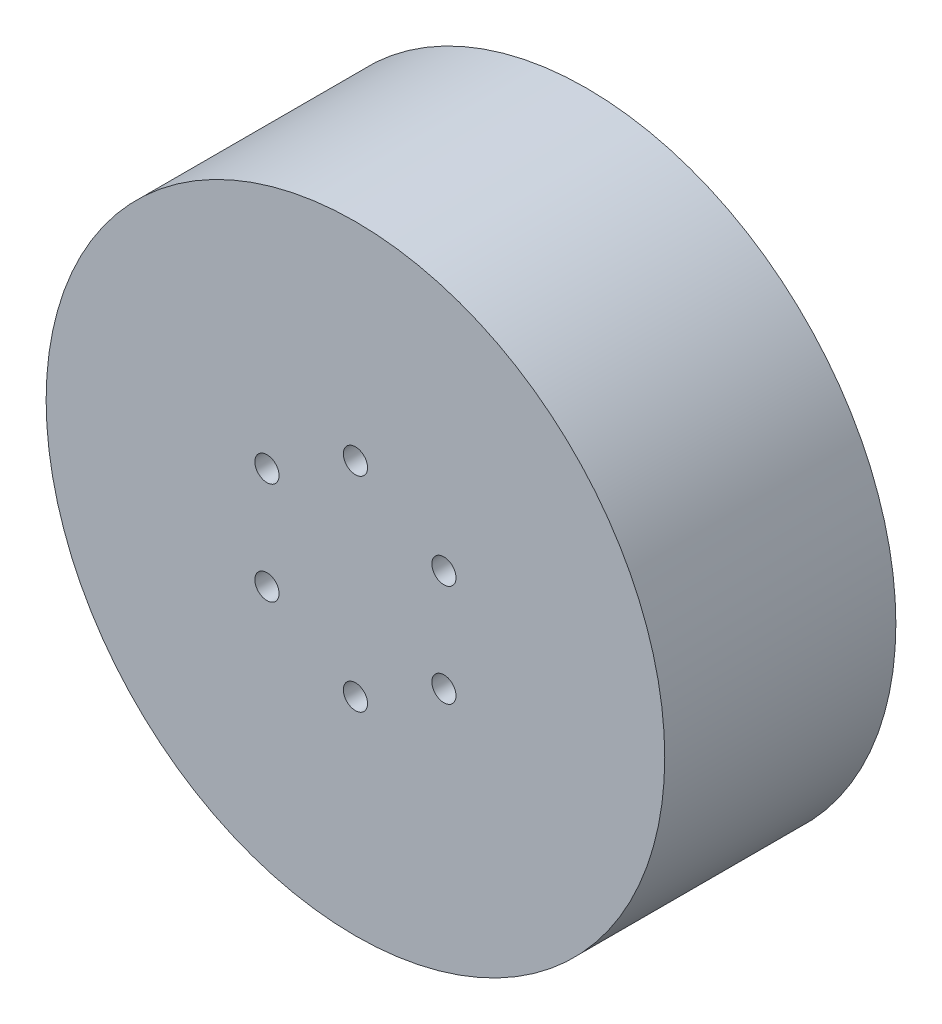
ISO-10303-21;
HEADER;
FILE_DESCRIPTION(('STEP AP214'),'2;1');
FILE_NAME('part.step','',(''),(''),'','','');
FILE_SCHEMA(('AUTOMOTIVE_DESIGN { 1 0 10303 214 1 1 1 1 }'));
ENDSEC;
DATA;
#1=APPLICATION_CONTEXT('core data for automotive mechanical design processes');
#2=APPLICATION_PROTOCOL_DEFINITION('international standard','automotive_design',2000,#1);
#3=PRODUCT_CONTEXT('',#1,'mechanical');
#4=PRODUCT('Part','Part','',(#3));
#5=PRODUCT_RELATED_PRODUCT_CATEGORY('part','',(#4));
#6=PRODUCT_DEFINITION_FORMATION('','',#4);
#7=PRODUCT_DEFINITION_CONTEXT('part definition',#1,'design');
#8=PRODUCT_DEFINITION('design','',#6,#7);
#9=PRODUCT_DEFINITION_SHAPE('','',#8);
#10=(LENGTH_UNIT() NAMED_UNIT(*) SI_UNIT(.MILLI.,.METRE.));
#11=(NAMED_UNIT(*) PLANE_ANGLE_UNIT() SI_UNIT($,.RADIAN.));
#12=(NAMED_UNIT(*) SI_UNIT($,.STERADIAN.) SOLID_ANGLE_UNIT());
#13=UNCERTAINTY_MEASURE_WITH_UNIT(LENGTH_MEASURE(1.E-05),#10,'distance_accuracy_value','');
#14=(GEOMETRIC_REPRESENTATION_CONTEXT(3) GLOBAL_UNCERTAINTY_ASSIGNED_CONTEXT((#13)) GLOBAL_UNIT_ASSIGNED_CONTEXT((#10,
#11,#12)) REPRESENTATION_CONTEXT('',''));
#15=CARTESIAN_POINT('',(0.,0.,0.));
#16=DIRECTION('',(0.,0.,1.));
#17=DIRECTION('',(1.,0.,0.));
#18=AXIS2_PLACEMENT_3D('',#15,#16,#17);
#19=CARTESIAN_POINT('',(0.,0.,-84.836));
#20=DIRECTION('',(0.,0.,1.));
#21=DIRECTION('',(1.,0.,0.));
#22=AXIS2_PLACEMENT_3D('',#19,#20,#21);
#23=CYLINDRICAL_SURFACE('',#22,113.538);
#24=CARTESIAN_POINT('',(0.,0.,-84.836));
#25=DIRECTION('',(0.,0.,1.));
#26=DIRECTION('',(1.,0.,0.));
#27=AXIS2_PLACEMENT_3D('',#24,#25,#26);
#28=CIRCLE('',#27,113.538);
#29=CARTESIAN_POINT('',(113.538,0.,-84.836));
#30=VERTEX_POINT('',#29);
#31=EDGE_CURVE('E51',#30,#30,#28,.T.);
#32=ORIENTED_EDGE('',*,*,#31,.T.);
#33=EDGE_LOOP('',(#32));
#34=FACE_BOUND('',#33,.T.);
#35=CARTESIAN_POINT('',(0.,0.,0.));
#36=DIRECTION('',(0.,0.,1.));
#37=DIRECTION('',(1.,0.,0.));
#38=AXIS2_PLACEMENT_3D('',#35,#36,#37);
#39=CIRCLE('',#38,113.538);
#40=CARTESIAN_POINT('',(113.538,0.,0.));
#41=VERTEX_POINT('',#40);
#42=EDGE_CURVE('E55',#41,#41,#39,.T.);
#43=ORIENTED_EDGE('',*,*,#42,.F.);
#44=EDGE_LOOP('',(#43));
#45=FACE_BOUND('',#44,.T.);
#46=ADVANCED_FACE('F45',(#34,#45),#23,.T.);
#47=CARTESIAN_POINT('',(0.,0.,-84.836));
#48=DIRECTION('',(0.,0.,1.));
#49=DIRECTION('',(1.,0.,0.));
#50=AXIS2_PLACEMENT_3D('',#47,#48,#49);
#51=PLANE('',#50);
#52=CARTESIAN_POINT('',(0.,0.,-84.836));
#53=DIRECTION('',(0.,0.,1.));
#54=DIRECTION('',(1.,0.,0.));
#55=AXIS2_PLACEMENT_3D('',#52,#53,#54);
#56=CIRCLE('',#55,23.8411510206952);
#57=CARTESIAN_POINT('',(23.8411510206952,0.,-84.836));
#58=VERTEX_POINT('',#57);
#59=EDGE_CURVE('E10',#58,#58,#56,.F.);
#60=ORIENTED_EDGE('',*,*,#59,.F.);
#61=EDGE_LOOP('',(#60));
#62=FACE_BOUND('',#61,.T.);
#63=CARTESIAN_POINT('',(-32.4759525812947,-18.749999965,-84.836));
#64=DIRECTION('',(0.,0.,1.));
#65=DIRECTION('',(1.,0.,0.));
#66=AXIS2_PLACEMENT_3D('',#63,#64,#65);
#67=CIRCLE('',#66,4.44499999999999);
#68=CARTESIAN_POINT('',(-28.0309525812947,-18.749999965,-84.836));
#69=VERTEX_POINT('',#68);
#70=EDGE_CURVE('E143',#69,#69,#67,.T.);
#71=ORIENTED_EDGE('',*,*,#70,.T.);
#72=EDGE_LOOP('',(#71));
#73=FACE_BOUND('',#72,.T.);
#74=CARTESIAN_POINT('',(0.,-37.49999993,-84.836));
#75=DIRECTION('',(0.,0.,1.));
#76=DIRECTION('',(1.,0.,0.));
#77=AXIS2_PLACEMENT_3D('',#74,#75,#76);
#78=CIRCLE('',#77,4.445);
#79=CARTESIAN_POINT('',(4.445,-37.49999993,-84.836));
#80=VERTEX_POINT('',#79);
#81=EDGE_CURVE('E146',#80,#80,#78,.T.);
#82=ORIENTED_EDGE('',*,*,#81,.T.);
#83=EDGE_LOOP('',(#82));
#84=FACE_BOUND('',#83,.T.);
#85=CARTESIAN_POINT('',(32.4759525812947,-18.749999965,-84.836));
#86=DIRECTION('',(0.,0.,1.));
#87=DIRECTION('',(1.,0.,0.));
#88=AXIS2_PLACEMENT_3D('',#85,#86,#87);
#89=CIRCLE('',#88,4.44499999999999);
#90=CARTESIAN_POINT('',(36.9209525812947,-18.749999965,-84.836));
#91=VERTEX_POINT('',#90);
#92=EDGE_CURVE('E154',#91,#91,#89,.T.);
#93=ORIENTED_EDGE('',*,*,#92,.T.);
#94=EDGE_LOOP('',(#93));
#95=FACE_BOUND('',#94,.T.);
#96=CARTESIAN_POINT('',(32.4759525812947,18.749999965,-84.836));
#97=DIRECTION('',(0.,0.,1.));
#98=DIRECTION('',(1.,0.,0.));
#99=AXIS2_PLACEMENT_3D('',#96,#97,#98);
#100=CIRCLE('',#99,4.44499999999999);
#101=CARTESIAN_POINT('',(36.9209525812947,18.749999965,-84.836));
#102=VERTEX_POINT('',#101);
#103=EDGE_CURVE('E151',#102,#102,#100,.T.);
#104=ORIENTED_EDGE('',*,*,#103,.T.);
#105=EDGE_LOOP('',(#104));
#106=FACE_BOUND('',#105,.T.);
#107=CARTESIAN_POINT('',(0.,37.49999993,-84.836));
#108=DIRECTION('',(0.,0.,1.));
#109=DIRECTION('',(1.,0.,0.));
#110=AXIS2_PLACEMENT_3D('',#107,#108,#109);
#111=CIRCLE('',#110,4.445);
#112=CARTESIAN_POINT('',(4.445,37.49999993,-84.836));
#113=VERTEX_POINT('',#112);
#114=EDGE_CURVE('E148',#113,#113,#111,.T.);
#115=ORIENTED_EDGE('',*,*,#114,.T.);
#116=EDGE_LOOP('',(#115));
#117=FACE_BOUND('',#116,.T.);
#118=CARTESIAN_POINT('',(-32.4759525812947,18.749999965,-84.836));
#119=DIRECTION('',(0.,0.,1.));
#120=DIRECTION('',(1.,0.,0.));
#121=AXIS2_PLACEMENT_3D('',#118,#119,#120);
#122=CIRCLE('',#121,4.44499999999999);
#123=CARTESIAN_POINT('',(-28.0309525812947,18.749999965,-84.836));
#124=VERTEX_POINT('',#123);
#125=EDGE_CURVE('E63',#124,#124,#122,.T.);
#126=ORIENTED_EDGE('',*,*,#125,.T.);
#127=EDGE_LOOP('',(#126));
#128=FACE_BOUND('',#127,.T.);
#129=ORIENTED_EDGE('',*,*,#31,.F.);
#130=EDGE_LOOP('',(#129));
#131=FACE_BOUND('',#130,.T.);
#132=ADVANCED_FACE('F90',(#62,#73,#84,#95,#106,#117,#128,#131),#51,.F.);
#133=CARTESIAN_POINT('',(0.,0.,0.));
#134=DIRECTION('',(0.,0.,1.));
#135=DIRECTION('',(1.,0.,0.));
#136=AXIS2_PLACEMENT_3D('',#133,#134,#135);
#137=PLANE('',#136);
#138=CARTESIAN_POINT('',(-32.4759525812947,-18.749999965,0.));
#139=DIRECTION('',(0.,0.,1.));
#140=DIRECTION('',(1.,0.,0.));
#141=AXIS2_PLACEMENT_3D('',#138,#139,#140);
#142=CIRCLE('',#141,4.44499999999999);
#143=CARTESIAN_POINT('',(-28.0309525812947,-18.749999965,0.));
#144=VERTEX_POINT('',#143);
#145=EDGE_CURVE('E60',#144,#144,#142,.T.);
#146=ORIENTED_EDGE('',*,*,#145,.F.);
#147=EDGE_LOOP('',(#146));
#148=FACE_BOUND('',#147,.T.);
#149=CARTESIAN_POINT('',(0.,-37.49999993,0.));
#150=DIRECTION('',(0.,0.,1.));
#151=DIRECTION('',(1.,0.,0.));
#152=AXIS2_PLACEMENT_3D('',#149,#150,#151);
#153=CIRCLE('',#152,4.445);
#154=CARTESIAN_POINT('',(4.445,-37.49999993,0.));
#155=VERTEX_POINT('',#154);
#156=EDGE_CURVE('E78',#155,#155,#153,.T.);
#157=ORIENTED_EDGE('',*,*,#156,.F.);
#158=EDGE_LOOP('',(#157));
#159=FACE_BOUND('',#158,.T.);
#160=CARTESIAN_POINT('',(32.4759525812947,-18.749999965,0.));
#161=DIRECTION('',(0.,0.,1.));
#162=DIRECTION('',(1.,0.,0.));
#163=AXIS2_PLACEMENT_3D('',#160,#161,#162);
#164=CIRCLE('',#163,4.44499999999999);
#165=CARTESIAN_POINT('',(36.9209525812947,-18.749999965,0.));
#166=VERTEX_POINT('',#165);
#167=EDGE_CURVE('E75',#166,#166,#164,.T.);
#168=ORIENTED_EDGE('',*,*,#167,.F.);
#169=EDGE_LOOP('',(#168));
#170=FACE_BOUND('',#169,.T.);
#171=CARTESIAN_POINT('',(32.4759525812947,18.749999965,0.));
#172=DIRECTION('',(0.,0.,1.));
#173=DIRECTION('',(1.,0.,0.));
#174=AXIS2_PLACEMENT_3D('',#171,#172,#173);
#175=CIRCLE('',#174,4.44499999999999);
#176=CARTESIAN_POINT('',(36.9209525812947,18.749999965,0.));
#177=VERTEX_POINT('',#176);
#178=EDGE_CURVE('E72',#177,#177,#175,.T.);
#179=ORIENTED_EDGE('',*,*,#178,.F.);
#180=EDGE_LOOP('',(#179));
#181=FACE_BOUND('',#180,.T.);
#182=CARTESIAN_POINT('',(0.,37.49999993,0.));
#183=DIRECTION('',(0.,0.,1.));
#184=DIRECTION('',(1.,0.,0.));
#185=AXIS2_PLACEMENT_3D('',#182,#183,#184);
#186=CIRCLE('',#185,4.445);
#187=CARTESIAN_POINT('',(4.445,37.49999993,0.));
#188=VERTEX_POINT('',#187);
#189=EDGE_CURVE('E69',#188,#188,#186,.T.);
#190=ORIENTED_EDGE('',*,*,#189,.F.);
#191=EDGE_LOOP('',(#190));
#192=FACE_BOUND('',#191,.T.);
#193=CARTESIAN_POINT('',(-32.4759525812947,18.749999965,0.));
#194=DIRECTION('',(0.,0.,1.));
#195=DIRECTION('',(1.,0.,0.));
#196=AXIS2_PLACEMENT_3D('',#193,#194,#195);
#197=CIRCLE('',#196,4.44499999999999);
#198=CARTESIAN_POINT('',(-28.0309525812947,18.749999965,0.));
#199=VERTEX_POINT('',#198);
#200=EDGE_CURVE('E66',#199,#199,#197,.T.);
#201=ORIENTED_EDGE('',*,*,#200,.F.);
#202=EDGE_LOOP('',(#201));
#203=FACE_BOUND('',#202,.T.);
#204=ORIENTED_EDGE('',*,*,#42,.T.);
#205=EDGE_LOOP('',(#204));
#206=FACE_BOUND('',#205,.T.);
#207=ADVANCED_FACE('F86',(#148,#159,#170,#181,#192,#203,#206),#137,.T.);
#208=CARTESIAN_POINT('',(-32.4759525812947,18.749999965,-84.836));
#209=DIRECTION('',(0.,0.,1.));
#210=DIRECTION('',(1.,0.,0.));
#211=AXIS2_PLACEMENT_3D('',#208,#209,#210);
#212=CYLINDRICAL_SURFACE('',#211,4.44499999999999);
#213=ORIENTED_EDGE('',*,*,#200,.T.);
#214=EDGE_LOOP('',(#213));
#215=FACE_BOUND('',#214,.T.);
#216=ORIENTED_EDGE('',*,*,#125,.F.);
#217=EDGE_LOOP('',(#216));
#218=FACE_BOUND('',#217,.T.);
#219=ADVANCED_FACE('F89',(#215,#218),#212,.F.);
#220=CARTESIAN_POINT('',(0.,37.49999993,-84.836));
#221=DIRECTION('',(0.,0.,1.));
#222=DIRECTION('',(1.,0.,0.));
#223=AXIS2_PLACEMENT_3D('',#220,#221,#222);
#224=CYLINDRICAL_SURFACE('',#223,4.445);
#225=ORIENTED_EDGE('',*,*,#189,.T.);
#226=EDGE_LOOP('',(#225));
#227=FACE_BOUND('',#226,.T.);
#228=ORIENTED_EDGE('',*,*,#114,.F.);
#229=EDGE_LOOP('',(#228));
#230=FACE_BOUND('',#229,.T.);
#231=ADVANCED_FACE('F114',(#227,#230),#224,.F.);
#232=CARTESIAN_POINT('',(32.4759525812947,18.749999965,-84.836));
#233=DIRECTION('',(0.,0.,1.));
#234=DIRECTION('',(1.,0.,0.));
#235=AXIS2_PLACEMENT_3D('',#232,#233,#234);
#236=CYLINDRICAL_SURFACE('',#235,4.44499999999999);
#237=ORIENTED_EDGE('',*,*,#178,.T.);
#238=EDGE_LOOP('',(#237));
#239=FACE_BOUND('',#238,.T.);
#240=ORIENTED_EDGE('',*,*,#103,.F.);
#241=EDGE_LOOP('',(#240));
#242=FACE_BOUND('',#241,.T.);
#243=ADVANCED_FACE('F126',(#239,#242),#236,.F.);
#244=CARTESIAN_POINT('',(32.4759525812947,-18.749999965,-84.836));
#245=DIRECTION('',(0.,0.,1.));
#246=DIRECTION('',(1.,0.,0.));
#247=AXIS2_PLACEMENT_3D('',#244,#245,#246);
#248=CYLINDRICAL_SURFACE('',#247,4.44499999999999);
#249=ORIENTED_EDGE('',*,*,#167,.T.);
#250=EDGE_LOOP('',(#249));
#251=FACE_BOUND('',#250,.T.);
#252=ORIENTED_EDGE('',*,*,#92,.F.);
#253=EDGE_LOOP('',(#252));
#254=FACE_BOUND('',#253,.T.);
#255=ADVANCED_FACE('F122',(#251,#254),#248,.F.);
#256=CARTESIAN_POINT('',(0.,-37.49999993,-84.836));
#257=DIRECTION('',(0.,0.,1.));
#258=DIRECTION('',(1.,0.,0.));
#259=AXIS2_PLACEMENT_3D('',#256,#257,#258);
#260=CYLINDRICAL_SURFACE('',#259,4.445);
#261=ORIENTED_EDGE('',*,*,#156,.T.);
#262=EDGE_LOOP('',(#261));
#263=FACE_BOUND('',#262,.T.);
#264=ORIENTED_EDGE('',*,*,#81,.F.);
#265=EDGE_LOOP('',(#264));
#266=FACE_BOUND('',#265,.T.);
#267=ADVANCED_FACE('F119',(#263,#266),#260,.F.);
#268=CARTESIAN_POINT('',(-32.4759525812947,-18.749999965,-84.836));
#269=DIRECTION('',(0.,0.,1.));
#270=DIRECTION('',(1.,0.,0.));
#271=AXIS2_PLACEMENT_3D('',#268,#269,#270);
#272=CYLINDRICAL_SURFACE('',#271,4.44499999999999);
#273=ORIENTED_EDGE('',*,*,#145,.T.);
#274=EDGE_LOOP('',(#273));
#275=FACE_BOUND('',#274,.T.);
#276=ORIENTED_EDGE('',*,*,#70,.F.);
#277=EDGE_LOOP('',(#276));
#278=FACE_BOUND('',#277,.T.);
#279=ADVANCED_FACE('F83',(#275,#278),#272,.F.);
#280=CARTESIAN_POINT('',(0.,0.,-98.806));
#281=DIRECTION('',(0.,0.,1.));
#282=DIRECTION('',(1.,0.,0.));
#283=AXIS2_PLACEMENT_3D('',#280,#281,#282);
#284=CYLINDRICAL_SURFACE('',#283,23.8411510206952);
#285=CARTESIAN_POINT('',(0.,0.,-98.806));
#286=DIRECTION('',(0.,0.,-1.));
#287=DIRECTION('',(-1.,0.,0.));
#288=AXIS2_PLACEMENT_3D('',#285,#286,#287);
#289=CIRCLE('',#288,23.8411510206952);
#290=CARTESIAN_POINT('',(-23.8411510206952,0.,-98.806));
#291=VERTEX_POINT('',#290);
#292=EDGE_CURVE('E142',#291,#291,#289,.T.);
#293=ORIENTED_EDGE('',*,*,#292,.F.);
#294=EDGE_LOOP('',(#293));
#295=FACE_BOUND('',#294,.T.);
#296=ORIENTED_EDGE('',*,*,#59,.T.);
#297=EDGE_LOOP('',(#296));
#298=FACE_BOUND('',#297,.T.);
#299=ADVANCED_FACE('F118',(#295,#298),#284,.T.);
#300=CARTESIAN_POINT('',(0.,0.,-98.806));
#301=DIRECTION('',(0.,0.,-1.));
#302=DIRECTION('',(-1.,0.,0.));
#303=AXIS2_PLACEMENT_3D('',#300,#301,#302);
#304=PLANE('',#303);
#305=ORIENTED_EDGE('',*,*,#292,.T.);
#306=EDGE_LOOP('',(#305));
#307=FACE_BOUND('',#306,.T.);
#308=ADVANCED_FACE('F135',(#307),#304,.T.);
#309=CLOSED_SHELL('',(#46,#132,#207,#219,#231,#243,#255,#267,#279,#299,#308));
#310=MANIFOLD_SOLID_BREP('B2',#309);
#311=ADVANCED_BREP_SHAPE_REPRESENTATION('',(#18,#310),#14);
#312=SHAPE_DEFINITION_REPRESENTATION(#9,#311);
ENDSEC;
END-ISO-10303-21;
